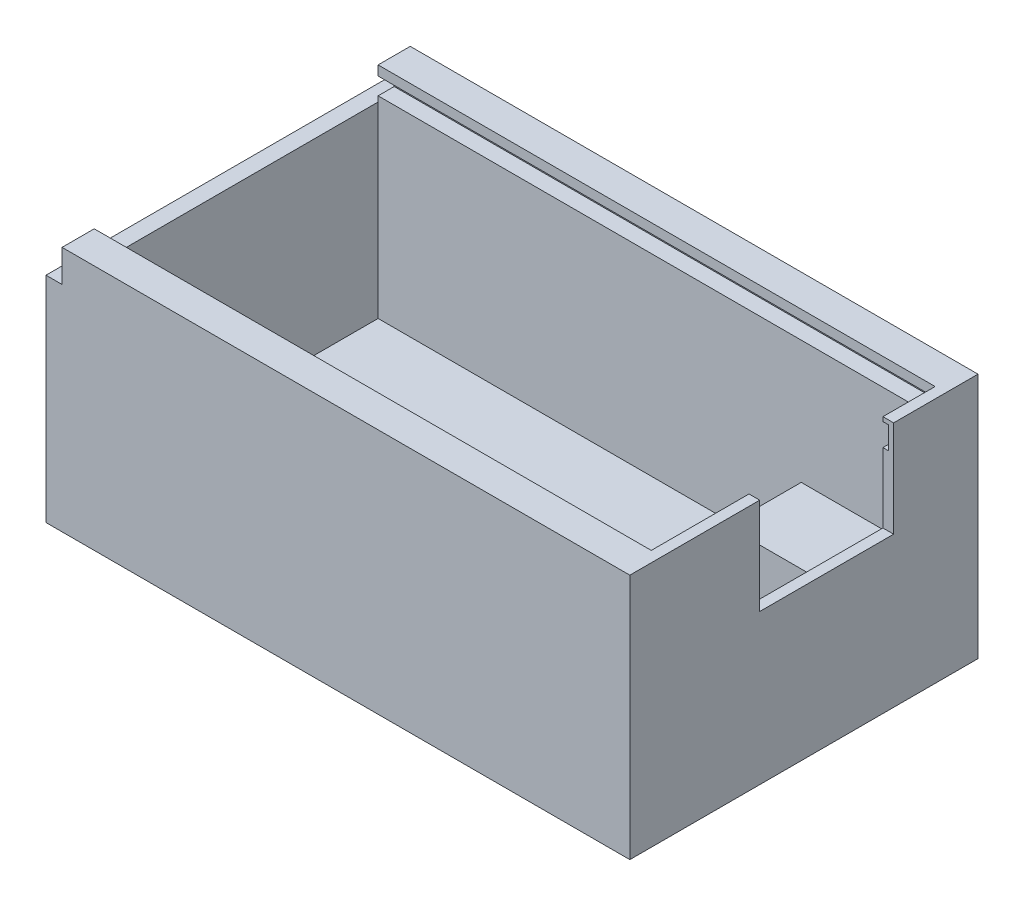
ISO-10303-21;
HEADER;
FILE_DESCRIPTION(('STEP AP214'),'2;1');
FILE_NAME('part.step','',(''),(''),'','','');
FILE_SCHEMA(('AUTOMOTIVE_DESIGN { 1 0 10303 214 1 1 1 1 }'));
ENDSEC;
DATA;
#1=APPLICATION_CONTEXT('core data for automotive mechanical design processes');
#2=APPLICATION_PROTOCOL_DEFINITION('international standard','automotive_design',2000,#1);
#3=PRODUCT_CONTEXT('',#1,'mechanical');
#4=PRODUCT('Part','Part','',(#3));
#5=PRODUCT_RELATED_PRODUCT_CATEGORY('part','',(#4));
#6=PRODUCT_DEFINITION_FORMATION('','',#4);
#7=PRODUCT_DEFINITION_CONTEXT('part definition',#1,'design');
#8=PRODUCT_DEFINITION('design','',#6,#7);
#9=PRODUCT_DEFINITION_SHAPE('','',#8);
#10=(LENGTH_UNIT() NAMED_UNIT(*) SI_UNIT(.MILLI.,.METRE.));
#11=(NAMED_UNIT(*) PLANE_ANGLE_UNIT() SI_UNIT($,.RADIAN.));
#12=(NAMED_UNIT(*) SI_UNIT($,.STERADIAN.) SOLID_ANGLE_UNIT());
#13=UNCERTAINTY_MEASURE_WITH_UNIT(LENGTH_MEASURE(1.E-05),#10,'distance_accuracy_value','');
#14=(GEOMETRIC_REPRESENTATION_CONTEXT(3) GLOBAL_UNCERTAINTY_ASSIGNED_CONTEXT((#13)) GLOBAL_UNIT_ASSIGNED_CONTEXT((#10,
#11,#12)) REPRESENTATION_CONTEXT('',''));
#15=CARTESIAN_POINT('',(0.,0.,0.));
#16=DIRECTION('',(0.,0.,1.));
#17=DIRECTION('',(1.,0.,0.));
#18=AXIS2_PLACEMENT_3D('',#15,#16,#17);
#19=CARTESIAN_POINT('',(104.,41.,0.));
#20=DIRECTION('',(-1.,0.,0.));
#21=DIRECTION('',(0.,0.,1.));
#22=AXIS2_PLACEMENT_3D('',#19,#20,#21);
#23=PLANE('',#22);
#24=DIRECTION('',(0.,0.,-1.));
#25=VECTOR('',#24,1.);
#26=CARTESIAN_POINT('',(104.,40.2,-53.));
#27=LINE('',#26,#25);
#28=CARTESIAN_POINT('',(104.,40.2,-43.25));
#29=VERTEX_POINT('',#28);
#30=CARTESIAN_POINT('',(104.,40.2,-53.));
#31=VERTEX_POINT('',#30);
#32=EDGE_CURVE('E745',#29,#31,#27,.T.);
#33=ORIENTED_EDGE('',*,*,#32,.F.);
#34=DIRECTION('',(0.,1.,0.));
#35=VECTOR('',#34,1.);
#36=CARTESIAN_POINT('',(104.,23.,-43.25));
#37=LINE('',#36,#35);
#38=CARTESIAN_POINT('',(104.,41.,-43.25));
#39=VERTEX_POINT('',#38);
#40=EDGE_CURVE('E417',#29,#39,#37,.T.);
#41=ORIENTED_EDGE('',*,*,#40,.T.);
#42=DIRECTION('',(0.,0.,1.));
#43=VECTOR('',#42,1.);
#44=CARTESIAN_POINT('',(104.,41.,-53.));
#45=LINE('',#44,#43);
#46=CARTESIAN_POINT('',(104.,41.,-53.));
#47=VERTEX_POINT('',#46);
#48=EDGE_CURVE('E394',#47,#39,#45,.T.);
#49=ORIENTED_EDGE('',*,*,#48,.F.);
#50=DIRECTION('',(0.,1.,0.));
#51=VECTOR('',#50,1.);
#52=CARTESIAN_POINT('',(104.,13.,-53.));
#53=LINE('',#52,#51);
#54=EDGE_CURVE('E399',#31,#47,#53,.T.);
#55=ORIENTED_EDGE('',*,*,#54,.F.);
#56=EDGE_LOOP('',(#33,#41,#49,#55));
#57=FACE_BOUND('',#56,.T.);
#58=ADVANCED_FACE('F48',(#57),#23,.T.);
#59=CARTESIAN_POINT('',(104.,40.2,0.));
#60=VERTEX_POINT('',#59);
#61=CARTESIAN_POINT('',(104.,40.2,-18.25));
#62=VERTEX_POINT('',#61);
#63=EDGE_CURVE('E308',#60,#62,#27,.T.);
#64=ORIENTED_EDGE('',*,*,#63,.F.);
#65=DIRECTION('',(0.,-1.,0.));
#66=VECTOR('',#65,1.);
#67=CARTESIAN_POINT('',(104.,13.,0.));
#68=LINE('',#67,#66);
#69=CARTESIAN_POINT('',(104.,41.,0.));
#70=VERTEX_POINT('',#69);
#71=EDGE_CURVE('E390',#70,#60,#68,.T.);
#72=ORIENTED_EDGE('',*,*,#71,.F.);
#73=DIRECTION('',(0.,0.,-1.));
#74=VECTOR('',#73,1.);
#75=CARTESIAN_POINT('',(104.,41.,0.));
#76=LINE('',#75,#74);
#77=CARTESIAN_POINT('',(104.,41.,-18.25));
#78=VERTEX_POINT('',#77);
#79=EDGE_CURVE('E497',#70,#78,#76,.T.);
#80=ORIENTED_EDGE('',*,*,#79,.T.);
#81=DIRECTION('',(0.,1.,0.));
#82=VECTOR('',#81,1.);
#83=CARTESIAN_POINT('',(104.,41.,-18.25));
#84=LINE('',#83,#82);
#85=EDGE_CURVE('E598',#62,#78,#84,.T.);
#86=ORIENTED_EDGE('',*,*,#85,.F.);
#87=EDGE_LOOP('',(#64,#72,#80,#86));
#88=FACE_BOUND('',#87,.T.);
#89=ADVANCED_FACE('F688',(#88),#23,.T.);
#90=CARTESIAN_POINT('',(110.886342439892,39.2,0.));
#91=DIRECTION('',(0.,0.,-1.));
#92=DIRECTION('',(-1.,0.,0.));
#93=AXIS2_PLACEMENT_3D('',#90,#91,#92);
#94=PLANE('',#93);
#95=DIRECTION('',(0.,1.,0.));
#96=VECTOR('',#95,1.);
#97=CARTESIAN_POINT('',(105.,40.2,0.));
#98=LINE('',#97,#96);
#99=CARTESIAN_POINT('',(105.,36.,0.));
#100=VERTEX_POINT('',#99);
#101=CARTESIAN_POINT('',(105.,39.2,0.));
#102=VERTEX_POINT('',#101);
#103=EDGE_CURVE('E838',#100,#102,#98,.T.);
#104=ORIENTED_EDGE('',*,*,#103,.F.);
#105=DIRECTION('',(-1.,0.,0.));
#106=VECTOR('',#105,1.);
#107=CARTESIAN_POINT('',(110.886342439892,36.,0.));
#108=LINE('',#107,#106);
#109=CARTESIAN_POINT('',(105.25,36.,0.));
#110=VERTEX_POINT('',#109);
#111=EDGE_CURVE('E360',#110,#100,#108,.T.);
#112=ORIENTED_EDGE('',*,*,#111,.F.);
#113=DIRECTION('',(0.,1.,0.));
#114=VECTOR('',#113,1.);
#115=CARTESIAN_POINT('',(105.25,39.2,0.));
#116=LINE('',#115,#114);
#117=CARTESIAN_POINT('',(105.25,39.2,0.));
#118=VERTEX_POINT('',#117);
#119=EDGE_CURVE('E349',#110,#118,#116,.T.);
#120=ORIENTED_EDGE('',*,*,#119,.T.);
#121=DIRECTION('',(-1.,0.,0.));
#122=VECTOR('',#121,1.);
#123=CARTESIAN_POINT('',(110.886342439892,39.2,0.));
#124=LINE('',#123,#122);
#125=EDGE_CURVE('E354',#118,#102,#124,.T.);
#126=ORIENTED_EDGE('',*,*,#125,.T.);
#127=EDGE_LOOP('',(#104,#112,#120,#126));
#128=FACE_BOUND('',#127,.T.);
#129=ADVANCED_FACE('F693',(#128),#94,.F.);
#130=CARTESIAN_POINT('',(110.886342439892,39.2,-53.));
#131=DIRECTION('',(0.,0.,1.));
#132=DIRECTION('',(1.,0.,0.));
#133=AXIS2_PLACEMENT_3D('',#130,#131,#132);
#134=PLANE('',#133);
#135=DIRECTION('',(0.,-1.,0.));
#136=VECTOR('',#135,1.);
#137=CARTESIAN_POINT('',(105.,40.2,-53.));
#138=LINE('',#137,#136);
#139=CARTESIAN_POINT('',(105.,39.2,-53.));
#140=VERTEX_POINT('',#139);
#141=CARTESIAN_POINT('',(105.,36.,-53.));
#142=VERTEX_POINT('',#141);
#143=EDGE_CURVE('E297',#140,#142,#138,.T.);
#144=ORIENTED_EDGE('',*,*,#143,.F.);
#145=DIRECTION('',(-1.,0.,0.));
#146=VECTOR('',#145,1.);
#147=CARTESIAN_POINT('',(110.886342439892,39.2,-53.));
#148=LINE('',#147,#146);
#149=CARTESIAN_POINT('',(105.25,39.2,-53.));
#150=VERTEX_POINT('',#149);
#151=EDGE_CURVE('E342',#150,#140,#148,.T.);
#152=ORIENTED_EDGE('',*,*,#151,.F.);
#153=DIRECTION('',(0.,-1.,0.));
#154=VECTOR('',#153,1.);
#155=CARTESIAN_POINT('',(105.25,39.2,-53.));
#156=LINE('',#155,#154);
#157=CARTESIAN_POINT('',(105.25,36.,-53.));
#158=VERTEX_POINT('',#157);
#159=EDGE_CURVE('E321',#150,#158,#156,.T.);
#160=ORIENTED_EDGE('',*,*,#159,.T.);
#161=DIRECTION('',(-1.,0.,0.));
#162=VECTOR('',#161,1.);
#163=CARTESIAN_POINT('',(110.886342439892,36.,-53.));
#164=LINE('',#163,#162);
#165=EDGE_CURVE('E313',#158,#142,#164,.T.);
#166=ORIENTED_EDGE('',*,*,#165,.T.);
#167=EDGE_LOOP('',(#144,#152,#160,#166));
#168=FACE_BOUND('',#167,.T.);
#169=ADVANCED_FACE('F319',(#168),#134,.F.);
#170=CARTESIAN_POINT('',(0.,41.,0.));
#171=DIRECTION('',(0.,0.,-1.));
#172=DIRECTION('',(-1.,0.,0.));
#173=AXIS2_PLACEMENT_3D('',#170,#171,#172);
#174=PLANE('',#173);
#175=CARTESIAN_POINT('',(0.,39.2,0.));
#176=VERTEX_POINT('',#175);
#177=EDGE_CURVE('E359',#102,#176,#124,.T.);
#178=ORIENTED_EDGE('',*,*,#177,.T.);
#179=DIRECTION('',(0.,-1.,0.));
#180=VECTOR('',#179,1.);
#181=CARTESIAN_POINT('',(0.,41.,0.));
#182=LINE('',#181,#180);
#183=CARTESIAN_POINT('',(0.,41.,0.));
#184=VERTEX_POINT('',#183);
#185=EDGE_CURVE('E582',#184,#176,#182,.T.);
#186=ORIENTED_EDGE('',*,*,#185,.F.);
#187=DIRECTION('',(1.,0.,0.));
#188=VECTOR('',#187,1.);
#189=CARTESIAN_POINT('',(0.,41.,0.));
#190=LINE('',#189,#188);
#191=EDGE_CURVE('E501',#184,#70,#190,.T.);
#192=ORIENTED_EDGE('',*,*,#191,.T.);
#193=ORIENTED_EDGE('',*,*,#71,.T.);
#194=DIRECTION('',(-1.,0.,0.));
#195=VECTOR('',#194,1.);
#196=CARTESIAN_POINT('',(105.,40.2,0.));
#197=LINE('',#196,#195);
#198=CARTESIAN_POINT('',(105.,40.2,0.));
#199=VERTEX_POINT('',#198);
#200=EDGE_CURVE('E757',#199,#60,#197,.T.);
#201=ORIENTED_EDGE('',*,*,#200,.F.);
#202=EDGE_CURVE('E317',#102,#199,#98,.T.);
#203=ORIENTED_EDGE('',*,*,#202,.F.);
#204=EDGE_LOOP('',(#178,#186,#192,#193,#201,#203));
#205=FACE_BOUND('',#204,.T.);
#206=ADVANCED_FACE('F739',(#205),#174,.T.);
#207=CARTESIAN_POINT('',(0.,41.,-53.));
#208=DIRECTION('',(0.,0.,-1.));
#209=DIRECTION('',(-1.,0.,0.));
#210=AXIS2_PLACEMENT_3D('',#207,#208,#209);
#211=PLANE('',#210);
#212=CARTESIAN_POINT('',(104.,13.,-53.));
#213=VERTEX_POINT('',#212);
#214=CARTESIAN_POINT('',(104.,36.,-53.));
#215=VERTEX_POINT('',#214);
#216=EDGE_CURVE('E400',#213,#215,#53,.T.);
#217=ORIENTED_EDGE('',*,*,#216,.T.);
#218=CARTESIAN_POINT('',(0.,36.,-53.));
#219=VERTEX_POINT('',#218);
#220=EDGE_CURVE('E325',#215,#219,#164,.T.);
#221=ORIENTED_EDGE('',*,*,#220,.T.);
#222=DIRECTION('',(0.,-1.,0.));
#223=VECTOR('',#222,1.);
#224=CARTESIAN_POINT('',(0.,41.,-53.));
#225=LINE('',#224,#223);
#226=CARTESIAN_POINT('',(0.,35.,-53.));
#227=VERTEX_POINT('',#226);
#228=EDGE_CURVE('E581',#219,#227,#225,.T.);
#229=ORIENTED_EDGE('',*,*,#228,.T.);
#230=CARTESIAN_POINT('',(0.,0.,-53.));
#231=VERTEX_POINT('',#230);
#232=EDGE_CURVE('E575',#227,#231,#225,.T.);
#233=ORIENTED_EDGE('',*,*,#232,.T.);
#234=DIRECTION('',(1.,0.,0.));
#235=VECTOR('',#234,1.);
#236=CARTESIAN_POINT('',(0.,0.,-53.));
#237=LINE('',#236,#235);
#238=CARTESIAN_POINT('',(79.,0.,-53.));
#239=VERTEX_POINT('',#238);
#240=EDGE_CURVE('E542',#231,#239,#237,.T.);
#241=ORIENTED_EDGE('',*,*,#240,.T.);
#242=DIRECTION('',(0.,-1.,0.));
#243=VECTOR('',#242,1.);
#244=CARTESIAN_POINT('',(79.,41.,-53.));
#245=LINE('',#244,#243);
#246=CARTESIAN_POINT('',(79.,13.,-53.));
#247=VERTEX_POINT('',#246);
#248=EDGE_CURVE('E572',#247,#239,#245,.T.);
#249=ORIENTED_EDGE('',*,*,#248,.F.);
#250=DIRECTION('',(-1.,0.,0.));
#251=VECTOR('',#250,1.);
#252=CARTESIAN_POINT('',(163.941638282583,13.,-53.));
#253=LINE('',#252,#251);
#254=EDGE_CURVE('E408',#213,#247,#253,.T.);
#255=ORIENTED_EDGE('',*,*,#254,.F.);
#256=EDGE_LOOP('',(#217,#221,#229,#233,#241,#249,#255));
#257=FACE_BOUND('',#256,.T.);
#258=ADVANCED_FACE('F660',(#257),#211,.F.);
#259=CARTESIAN_POINT('',(96.,23.,-43.25));
#260=DIRECTION('',(0.,0.,-1.));
#261=DIRECTION('',(-1.,0.,0.));
#262=AXIS2_PLACEMENT_3D('',#259,#260,#261);
#263=PLANE('',#262);
#264=ORIENTED_EDGE('',*,*,#40,.F.);
#265=DIRECTION('',(1.,0.,0.));
#266=VECTOR('',#265,1.);
#267=CARTESIAN_POINT('',(96.,40.2,-43.25));
#268=LINE('',#267,#266);
#269=CARTESIAN_POINT('',(105.,40.2,-43.25));
#270=VERTEX_POINT('',#269);
#271=EDGE_CURVE('E353',#29,#270,#268,.T.);
#272=ORIENTED_EDGE('',*,*,#271,.T.);
#273=DIRECTION('',(0.,1.,0.));
#274=VECTOR('',#273,1.);
#275=CARTESIAN_POINT('',(105.,23.,-43.25));
#276=LINE('',#275,#274);
#277=CARTESIAN_POINT('',(105.,36.,-43.25));
#278=VERTEX_POINT('',#277);
#279=EDGE_CURVE('E763',#278,#270,#276,.T.);
#280=ORIENTED_EDGE('',*,*,#279,.F.);
#281=DIRECTION('',(-1.,0.,0.));
#282=VECTOR('',#281,1.);
#283=CARTESIAN_POINT('',(96.,36.,-43.25));
#284=LINE('',#283,#282);
#285=CARTESIAN_POINT('',(104.,36.,-43.25));
#286=VERTEX_POINT('',#285);
#287=EDGE_CURVE('E315',#278,#286,#284,.T.);
#288=ORIENTED_EDGE('',*,*,#287,.T.);
#289=CARTESIAN_POINT('',(104.,23.,-43.25));
#290=VERTEX_POINT('',#289);
#291=EDGE_CURVE('E418',#290,#286,#37,.T.);
#292=ORIENTED_EDGE('',*,*,#291,.F.);
#293=DIRECTION('',(1.,0.,0.));
#294=VECTOR('',#293,1.);
#295=CARTESIAN_POINT('',(96.,23.,-43.25));
#296=LINE('',#295,#294);
#297=CARTESIAN_POINT('',(106.,23.,-43.25));
#298=VERTEX_POINT('',#297);
#299=EDGE_CURVE('E445',#290,#298,#296,.T.);
#300=ORIENTED_EDGE('',*,*,#299,.T.);
#301=DIRECTION('',(0.,1.,0.));
#302=VECTOR('',#301,1.);
#303=CARTESIAN_POINT('',(106.,23.,-43.25));
#304=LINE('',#303,#302);
#305=CARTESIAN_POINT('',(106.,41.,-43.25));
#306=VERTEX_POINT('',#305);
#307=EDGE_CURVE('E433',#298,#306,#304,.T.);
#308=ORIENTED_EDGE('',*,*,#307,.T.);
#309=DIRECTION('',(1.,0.,0.));
#310=VECTOR('',#309,1.);
#311=CARTESIAN_POINT('',(96.,41.,-43.25));
#312=LINE('',#311,#310);
#313=EDGE_CURVE('E442',#39,#306,#312,.T.);
#314=ORIENTED_EDGE('',*,*,#313,.F.);
#315=EDGE_LOOP('',(#264,#272,#280,#288,#292,#300,#308,#314));
#316=FACE_BOUND('',#315,.T.);
#317=ADVANCED_FACE('F775',(#316),#263,.F.);
#318=CARTESIAN_POINT('',(96.,23.,-18.25));
#319=DIRECTION('',(0.,-1.,0.));
#320=DIRECTION('',(0.,0.,-1.));
#321=AXIS2_PLACEMENT_3D('',#318,#319,#320);
#322=PLANE('',#321);
#323=ORIENTED_EDGE('',*,*,#299,.F.);
#324=DIRECTION('',(0.,0.,1.));
#325=VECTOR('',#324,1.);
#326=CARTESIAN_POINT('',(104.,23.,0.));
#327=LINE('',#326,#325);
#328=CARTESIAN_POINT('',(104.,23.,-18.25));
#329=VERTEX_POINT('',#328);
#330=EDGE_CURVE('E441',#290,#329,#327,.T.);
#331=ORIENTED_EDGE('',*,*,#330,.T.);
#332=DIRECTION('',(1.,0.,0.));
#333=VECTOR('',#332,1.);
#334=CARTESIAN_POINT('',(96.,23.,-18.25));
#335=LINE('',#334,#333);
#336=CARTESIAN_POINT('',(106.,23.,-18.25));
#337=VERTEX_POINT('',#336);
#338=EDGE_CURVE('E437',#329,#337,#335,.T.);
#339=ORIENTED_EDGE('',*,*,#338,.T.);
#340=DIRECTION('',(0.,0.,-1.));
#341=VECTOR('',#340,1.);
#342=CARTESIAN_POINT('',(106.,23.,-18.25));
#343=LINE('',#342,#341);
#344=EDGE_CURVE('E429',#337,#298,#343,.T.);
#345=ORIENTED_EDGE('',*,*,#344,.T.);
#346=EDGE_LOOP('',(#323,#331,#339,#345));
#347=FACE_BOUND('',#346,.T.);
#348=ADVANCED_FACE('F804',(#347),#322,.F.);
#349=CARTESIAN_POINT('',(0.,41.,0.));
#350=DIRECTION('',(0.,1.,0.));
#351=DIRECTION('',(0.,0.,1.));
#352=AXIS2_PLACEMENT_3D('',#349,#350,#351);
#353=PLANE('',#352);
#354=ORIENTED_EDGE('',*,*,#79,.F.);
#355=ORIENTED_EDGE('',*,*,#191,.F.);
#356=DIRECTION('',(0.,0.,1.));
#357=VECTOR('',#356,1.);
#358=CARTESIAN_POINT('',(0.,41.,0.));
#359=LINE('',#358,#357);
#360=CARTESIAN_POINT('',(0.,41.,6.));
#361=VERTEX_POINT('',#360);
#362=EDGE_CURVE('E566',#184,#361,#359,.T.);
#363=ORIENTED_EDGE('',*,*,#362,.T.);
#364=DIRECTION('',(1.,0.,0.));
#365=VECTOR('',#364,1.);
#366=CARTESIAN_POINT('',(0.,41.,6.));
#367=LINE('',#366,#365);
#368=CARTESIAN_POINT('',(106.,41.,6.));
#369=VERTEX_POINT('',#368);
#370=EDGE_CURVE('E510',#361,#369,#367,.T.);
#371=ORIENTED_EDGE('',*,*,#370,.T.);
#372=DIRECTION('',(0.,0.,-1.));
#373=VECTOR('',#372,1.);
#374=CARTESIAN_POINT('',(106.,41.,0.));
#375=LINE('',#374,#373);
#376=CARTESIAN_POINT('',(106.,41.,-18.25));
#377=VERTEX_POINT('',#376);
#378=EDGE_CURVE('E514',#369,#377,#375,.T.);
#379=ORIENTED_EDGE('',*,*,#378,.T.);
#380=DIRECTION('',(1.,0.,0.));
#381=VECTOR('',#380,1.);
#382=CARTESIAN_POINT('',(96.,41.,-18.25));
#383=LINE('',#382,#381);
#384=EDGE_CURVE('E438',#78,#377,#383,.T.);
#385=ORIENTED_EDGE('',*,*,#384,.F.);
#386=EDGE_LOOP('',(#354,#355,#363,#371,#379,#385));
#387=FACE_BOUND('',#386,.T.);
#388=ADVANCED_FACE('F721',(#387),#353,.T.);
#389=DIRECTION('',(1.,0.,0.));
#390=VECTOR('',#389,1.);
#391=CARTESIAN_POINT('',(0.,41.,-53.));
#392=LINE('',#391,#390);
#393=CARTESIAN_POINT('',(0.,41.,-53.));
#394=VERTEX_POINT('',#393);
#395=EDGE_CURVE('E506',#394,#47,#392,.T.);
#396=ORIENTED_EDGE('',*,*,#395,.T.);
#397=ORIENTED_EDGE('',*,*,#48,.T.);
#398=ORIENTED_EDGE('',*,*,#313,.T.);
#399=CARTESIAN_POINT('',(106.,41.,-59.));
#400=VERTEX_POINT('',#399);
#401=EDGE_CURVE('E513',#306,#400,#375,.T.);
#402=ORIENTED_EDGE('',*,*,#401,.T.);
#403=DIRECTION('',(1.,0.,0.));
#404=VECTOR('',#403,1.);
#405=CARTESIAN_POINT('',(0.,41.,-59.));
#406=LINE('',#405,#404);
#407=CARTESIAN_POINT('',(0.,41.,-59.));
#408=VERTEX_POINT('',#407);
#409=EDGE_CURVE('E518',#408,#400,#406,.T.);
#410=ORIENTED_EDGE('',*,*,#409,.F.);
#411=DIRECTION('',(0.,0.,1.));
#412=VECTOR('',#411,1.);
#413=CARTESIAN_POINT('',(0.,41.,-59.));
#414=LINE('',#413,#412);
#415=EDGE_CURVE('E467',#408,#394,#414,.T.);
#416=ORIENTED_EDGE('',*,*,#415,.T.);
#417=EDGE_LOOP('',(#396,#397,#398,#402,#410,#416));
#418=FACE_BOUND('',#417,.T.);
#419=ADVANCED_FACE('F716',(#418),#353,.T.);
#420=CARTESIAN_POINT('',(0.,41.,6.));
#421=DIRECTION('',(0.,0.,-1.));
#422=DIRECTION('',(-1.,0.,0.));
#423=AXIS2_PLACEMENT_3D('',#420,#421,#422);
#424=PLANE('',#423);
#425=DIRECTION('',(0.,-1.,0.));
#426=VECTOR('',#425,1.);
#427=CARTESIAN_POINT('',(0.,41.,6.));
#428=LINE('',#427,#426);
#429=CARTESIAN_POINT('',(0.,35.,6.));
#430=VERTEX_POINT('',#429);
#431=EDGE_CURVE('E462',#361,#430,#428,.T.);
#432=ORIENTED_EDGE('',*,*,#431,.T.);
#433=DIRECTION('',(-1.,0.,0.));
#434=VECTOR('',#433,1.);
#435=CARTESIAN_POINT('',(0.,35.,6.));
#436=LINE('',#435,#434);
#437=CARTESIAN_POINT('',(-3.,35.,6.));
#438=VERTEX_POINT('',#437);
#439=EDGE_CURVE('E474',#430,#438,#436,.T.);
#440=ORIENTED_EDGE('',*,*,#439,.T.);
#441=DIRECTION('',(0.,-1.,0.));
#442=VECTOR('',#441,1.);
#443=CARTESIAN_POINT('',(-3.,41.,6.));
#444=LINE('',#443,#442);
#445=CARTESIAN_POINT('',(-3.,-5.,6.));
#446=VERTEX_POINT('',#445);
#447=EDGE_CURVE('E553',#438,#446,#444,.T.);
#448=ORIENTED_EDGE('',*,*,#447,.T.);
#449=DIRECTION('',(-1.,0.,0.));
#450=VECTOR('',#449,1.);
#451=CARTESIAN_POINT('',(-3.,-5.,6.));
#452=LINE('',#451,#450);
#453=CARTESIAN_POINT('',(106.,-5.,6.));
#454=VERTEX_POINT('',#453);
#455=EDGE_CURVE('E492',#454,#446,#452,.T.);
#456=ORIENTED_EDGE('',*,*,#455,.F.);
#457=DIRECTION('',(0.,-1.,0.));
#458=VECTOR('',#457,1.);
#459=CARTESIAN_POINT('',(106.,41.,6.));
#460=LINE('',#459,#458);
#461=EDGE_CURVE('E563',#369,#454,#460,.T.);
#462=ORIENTED_EDGE('',*,*,#461,.F.);
#463=ORIENTED_EDGE('',*,*,#370,.F.);
#464=EDGE_LOOP('',(#432,#440,#448,#456,#462,#463));
#465=FACE_BOUND('',#464,.T.);
#466=ADVANCED_FACE('F708',(#465),#424,.F.);
#467=CARTESIAN_POINT('',(106.,41.,0.));
#468=DIRECTION('',(-1.,0.,0.));
#469=DIRECTION('',(0.,0.,1.));
#470=AXIS2_PLACEMENT_3D('',#467,#468,#469);
#471=PLANE('',#470);
#472=ORIENTED_EDGE('',*,*,#344,.F.);
#473=DIRECTION('',(0.,-1.,0.));
#474=VECTOR('',#473,1.);
#475=CARTESIAN_POINT('',(106.,23.,-18.25));
#476=LINE('',#475,#474);
#477=EDGE_CURVE('E425',#377,#337,#476,.T.);
#478=ORIENTED_EDGE('',*,*,#477,.F.);
#479=ORIENTED_EDGE('',*,*,#378,.F.);
#480=ORIENTED_EDGE('',*,*,#461,.T.);
#481=DIRECTION('',(0.,0.,1.));
#482=VECTOR('',#481,1.);
#483=CARTESIAN_POINT('',(106.,-5.,6.));
#484=LINE('',#483,#482);
#485=CARTESIAN_POINT('',(106.,-5.,-59.));
#486=VERTEX_POINT('',#485);
#487=EDGE_CURVE('E488',#486,#454,#484,.T.);
#488=ORIENTED_EDGE('',*,*,#487,.F.);
#489=DIRECTION('',(0.,-1.,0.));
#490=VECTOR('',#489,1.);
#491=CARTESIAN_POINT('',(106.,41.,-59.));
#492=LINE('',#491,#490);
#493=EDGE_CURVE('E560',#400,#486,#492,.T.);
#494=ORIENTED_EDGE('',*,*,#493,.F.);
#495=ORIENTED_EDGE('',*,*,#401,.F.);
#496=ORIENTED_EDGE('',*,*,#307,.F.);
#497=EDGE_LOOP('',(#472,#478,#479,#480,#488,#494,#495,#496));
#498=FACE_BOUND('',#497,.T.);
#499=ADVANCED_FACE('F702',(#498),#471,.F.);
#500=CARTESIAN_POINT('',(0.,41.,-59.));
#501=DIRECTION('',(0.,0.,-1.));
#502=DIRECTION('',(-1.,0.,0.));
#503=AXIS2_PLACEMENT_3D('',#500,#501,#502);
#504=PLANE('',#503);
#505=DIRECTION('',(-1.,0.,0.));
#506=VECTOR('',#505,1.);
#507=CARTESIAN_POINT('',(0.,35.,-59.));
#508=LINE('',#507,#506);
#509=CARTESIAN_POINT('',(0.,35.,-59.));
#510=VERTEX_POINT('',#509);
#511=CARTESIAN_POINT('',(-3.,35.,-59.));
#512=VERTEX_POINT('',#511);
#513=EDGE_CURVE('E471',#510,#512,#508,.T.);
#514=ORIENTED_EDGE('',*,*,#513,.F.);
#515=DIRECTION('',(0.,-1.,0.));
#516=VECTOR('',#515,1.);
#517=CARTESIAN_POINT('',(0.,41.,-59.));
#518=LINE('',#517,#516);
#519=EDGE_CURVE('E453',#408,#510,#518,.T.);
#520=ORIENTED_EDGE('',*,*,#519,.F.);
#521=ORIENTED_EDGE('',*,*,#409,.T.);
#522=ORIENTED_EDGE('',*,*,#493,.T.);
#523=DIRECTION('',(1.,0.,0.));
#524=VECTOR('',#523,1.);
#525=CARTESIAN_POINT('',(-3.,-5.,-59.));
#526=LINE('',#525,#524);
#527=CARTESIAN_POINT('',(-3.,-5.,-59.));
#528=VERTEX_POINT('',#527);
#529=EDGE_CURVE('E484',#528,#486,#526,.T.);
#530=ORIENTED_EDGE('',*,*,#529,.F.);
#531=DIRECTION('',(0.,-1.,0.));
#532=VECTOR('',#531,1.);
#533=CARTESIAN_POINT('',(-3.,41.,-59.));
#534=LINE('',#533,#532);
#535=EDGE_CURVE('E556',#512,#528,#534,.T.);
#536=ORIENTED_EDGE('',*,*,#535,.F.);
#537=EDGE_LOOP('',(#514,#520,#521,#522,#530,#536));
#538=FACE_BOUND('',#537,.T.);
#539=ADVANCED_FACE('F697',(#538),#504,.T.);
#540=DIRECTION('',(0.,0.,1.));
#541=VECTOR('',#540,1.);
#542=CARTESIAN_POINT('',(104.,36.,-53.));
#543=LINE('',#542,#541);
#544=EDGE_CURVE('E748',#215,#286,#543,.T.);
#545=ORIENTED_EDGE('',*,*,#544,.F.);
#546=ORIENTED_EDGE('',*,*,#216,.F.);
#547=DIRECTION('',(0.,0.,-1.));
#548=VECTOR('',#547,1.);
#549=CARTESIAN_POINT('',(104.,13.,-53.));
#550=LINE('',#549,#548);
#551=CARTESIAN_POINT('',(104.,13.,-39.));
#552=VERTEX_POINT('',#551);
#553=EDGE_CURVE('E404',#552,#213,#550,.T.);
#554=ORIENTED_EDGE('',*,*,#553,.F.);
#555=DIRECTION('',(0.,-1.,0.));
#556=VECTOR('',#555,1.);
#557=CARTESIAN_POINT('',(104.,41.,-39.));
#558=LINE('',#557,#556);
#559=CARTESIAN_POINT('',(104.,0.,-39.));
#560=VERTEX_POINT('',#559);
#561=EDGE_CURVE('E522',#552,#560,#558,.T.);
#562=ORIENTED_EDGE('',*,*,#561,.T.);
#563=DIRECTION('',(0.,0.,-1.));
#564=VECTOR('',#563,1.);
#565=CARTESIAN_POINT('',(104.,0.,0.));
#566=LINE('',#565,#564);
#567=CARTESIAN_POINT('',(104.,0.,-14.));
#568=VERTEX_POINT('',#567);
#569=EDGE_CURVE('E496',#568,#560,#566,.T.);
#570=ORIENTED_EDGE('',*,*,#569,.F.);
#571=DIRECTION('',(0.,-1.,0.));
#572=VECTOR('',#571,1.);
#573=CARTESIAN_POINT('',(104.,41.,-14.));
#574=LINE('',#573,#572);
#575=CARTESIAN_POINT('',(104.,13.,-14.));
#576=VERTEX_POINT('',#575);
#577=EDGE_CURVE('E557',#576,#568,#574,.T.);
#578=ORIENTED_EDGE('',*,*,#577,.F.);
#579=CARTESIAN_POINT('',(104.,13.,0.));
#580=VERTEX_POINT('',#579);
#581=EDGE_CURVE('E414',#580,#576,#550,.T.);
#582=ORIENTED_EDGE('',*,*,#581,.F.);
#583=CARTESIAN_POINT('',(104.,36.,0.));
#584=VERTEX_POINT('',#583);
#585=EDGE_CURVE('E395',#584,#580,#68,.T.);
#586=ORIENTED_EDGE('',*,*,#585,.F.);
#587=CARTESIAN_POINT('',(104.,36.,-18.25));
#588=VERTEX_POINT('',#587);
#589=EDGE_CURVE('E793',#588,#584,#543,.T.);
#590=ORIENTED_EDGE('',*,*,#589,.F.);
#591=EDGE_CURVE('E599',#329,#588,#84,.T.);
#592=ORIENTED_EDGE('',*,*,#591,.F.);
#593=ORIENTED_EDGE('',*,*,#330,.F.);
#594=ORIENTED_EDGE('',*,*,#291,.T.);
#595=EDGE_LOOP('',(#545,#546,#554,#562,#570,#578,#582,#586,#590,#592,#593,#594));
#596=FACE_BOUND('',#595,.T.);
#597=ADVANCED_FACE('F50',(#596),#23,.T.);
#598=CARTESIAN_POINT('',(0.,41.,-14.));
#599=DIRECTION('',(0.,0.,-1.));
#600=DIRECTION('',(-1.,0.,0.));
#601=AXIS2_PLACEMENT_3D('',#598,#599,#600);
#602=PLANE('',#601);
#603=DIRECTION('',(-1.,0.,0.));
#604=VECTOR('',#603,1.);
#605=CARTESIAN_POINT('',(0.,13.,-14.));
#606=LINE('',#605,#604);
#607=CARTESIAN_POINT('',(79.,13.,-14.));
#608=VERTEX_POINT('',#607);
#609=EDGE_CURVE('E422',#576,#608,#606,.T.);
#610=ORIENTED_EDGE('',*,*,#609,.F.);
#611=ORIENTED_EDGE('',*,*,#577,.T.);
#612=DIRECTION('',(1.,0.,0.));
#613=VECTOR('',#612,1.);
#614=CARTESIAN_POINT('',(0.,0.,-14.));
#615=LINE('',#614,#613);
#616=CARTESIAN_POINT('',(79.,0.,-14.));
#617=VERTEX_POINT('',#616);
#618=EDGE_CURVE('E526',#617,#568,#615,.T.);
#619=ORIENTED_EDGE('',*,*,#618,.F.);
#620=DIRECTION('',(0.,-1.,0.));
#621=VECTOR('',#620,1.);
#622=CARTESIAN_POINT('',(79.,41.,-14.));
#623=LINE('',#622,#621);
#624=EDGE_CURVE('E590',#608,#617,#623,.T.);
#625=ORIENTED_EDGE('',*,*,#624,.F.);
#626=EDGE_LOOP('',(#610,#611,#619,#625));
#627=FACE_BOUND('',#626,.T.);
#628=ADVANCED_FACE('F628',(#627),#602,.T.);
#629=CARTESIAN_POINT('',(79.,41.,0.));
#630=DIRECTION('',(1.,0.,0.));
#631=DIRECTION('',(0.,0.,-1.));
#632=AXIS2_PLACEMENT_3D('',#629,#630,#631);
#633=PLANE('',#632);
#634=DIRECTION('',(0.,-1.,0.));
#635=VECTOR('',#634,1.);
#636=CARTESIAN_POINT('',(79.,41.,0.));
#637=LINE('',#636,#635);
#638=CARTESIAN_POINT('',(79.,13.,0.));
#639=VERTEX_POINT('',#638);
#640=CARTESIAN_POINT('',(79.,0.,0.));
#641=VERTEX_POINT('',#640);
#642=EDGE_CURVE('E586',#639,#641,#637,.T.);
#643=ORIENTED_EDGE('',*,*,#642,.F.);
#644=DIRECTION('',(0.,0.,1.));
#645=VECTOR('',#644,1.);
#646=CARTESIAN_POINT('',(79.,13.,-53.));
#647=LINE('',#646,#645);
#648=EDGE_CURVE('E348',#608,#639,#647,.T.);
#649=ORIENTED_EDGE('',*,*,#648,.F.);
#650=ORIENTED_EDGE('',*,*,#624,.T.);
#651=DIRECTION('',(0.,0.,1.));
#652=VECTOR('',#651,1.);
#653=CARTESIAN_POINT('',(79.,0.,0.));
#654=LINE('',#653,#652);
#655=EDGE_CURVE('E530',#617,#641,#654,.T.);
#656=ORIENTED_EDGE('',*,*,#655,.T.);
#657=EDGE_LOOP('',(#643,#649,#650,#656));
#658=FACE_BOUND('',#657,.T.);
#659=ADVANCED_FACE('F637',(#658),#633,.F.);
#660=CARTESIAN_POINT('',(0.,36.,0.));
#661=VERTEX_POINT('',#660);
#662=EDGE_CURVE('E364',#584,#661,#108,.T.);
#663=ORIENTED_EDGE('',*,*,#662,.F.);
#664=ORIENTED_EDGE('',*,*,#585,.T.);
#665=DIRECTION('',(-1.,0.,0.));
#666=VECTOR('',#665,1.);
#667=CARTESIAN_POINT('',(163.941638282583,13.,0.));
#668=LINE('',#667,#666);
#669=EDGE_CURVE('E409',#580,#639,#668,.T.);
#670=ORIENTED_EDGE('',*,*,#669,.T.);
#671=ORIENTED_EDGE('',*,*,#642,.T.);
#672=DIRECTION('',(1.,0.,0.));
#673=VECTOR('',#672,1.);
#674=CARTESIAN_POINT('',(0.,0.,0.));
#675=LINE('',#674,#673);
#676=CARTESIAN_POINT('',(0.,0.,0.));
#677=VERTEX_POINT('',#676);
#678=EDGE_CURVE('E534',#677,#641,#675,.T.);
#679=ORIENTED_EDGE('',*,*,#678,.F.);
#680=CARTESIAN_POINT('',(0.,35.,0.));
#681=VERTEX_POINT('',#680);
#682=EDGE_CURVE('E580',#681,#677,#182,.T.);
#683=ORIENTED_EDGE('',*,*,#682,.F.);
#684=EDGE_CURVE('E587',#661,#681,#182,.T.);
#685=ORIENTED_EDGE('',*,*,#684,.F.);
#686=EDGE_LOOP('',(#663,#664,#670,#671,#679,#683,#685));
#687=FACE_BOUND('',#686,.T.);
#688=ADVANCED_FACE('F789',(#687),#174,.T.);
#689=CARTESIAN_POINT('',(0.,41.,0.));
#690=DIRECTION('',(-1.,0.,0.));
#691=DIRECTION('',(0.,0.,1.));
#692=AXIS2_PLACEMENT_3D('',#689,#690,#691);
#693=PLANE('',#692);
#694=ORIENTED_EDGE('',*,*,#232,.F.);
#695=DIRECTION('',(0.,0.,1.));
#696=VECTOR('',#695,1.);
#697=CARTESIAN_POINT('',(0.,35.,-59.));
#698=LINE('',#697,#696);
#699=EDGE_CURVE('E463',#227,#681,#698,.T.);
#700=ORIENTED_EDGE('',*,*,#699,.T.);
#701=ORIENTED_EDGE('',*,*,#682,.T.);
#702=DIRECTION('',(0.,0.,-1.));
#703=VECTOR('',#702,1.);
#704=CARTESIAN_POINT('',(0.,0.,0.));
#705=LINE('',#704,#703);
#706=EDGE_CURVE('E538',#677,#231,#705,.T.);
#707=ORIENTED_EDGE('',*,*,#706,.T.);
#708=EDGE_LOOP('',(#694,#700,#701,#707));
#709=FACE_BOUND('',#708,.T.);
#710=ADVANCED_FACE('F671',(#709),#693,.F.);
#711=CARTESIAN_POINT('',(0.,39.2,-53.));
#712=VERTEX_POINT('',#711);
#713=EDGE_CURVE('E576',#394,#712,#225,.T.);
#714=ORIENTED_EDGE('',*,*,#713,.T.);
#715=EDGE_CURVE('E72',#140,#712,#148,.T.);
#716=ORIENTED_EDGE('',*,*,#715,.F.);
#717=CARTESIAN_POINT('',(105.,40.2,-53.));
#718=VERTEX_POINT('',#717);
#719=EDGE_CURVE('E303',#718,#140,#138,.T.);
#720=ORIENTED_EDGE('',*,*,#719,.F.);
#721=DIRECTION('',(-1.,0.,0.));
#722=VECTOR('',#721,1.);
#723=CARTESIAN_POINT('',(105.,40.2,-53.));
#724=LINE('',#723,#722);
#725=EDGE_CURVE('E752',#718,#31,#724,.T.);
#726=ORIENTED_EDGE('',*,*,#725,.T.);
#727=ORIENTED_EDGE('',*,*,#54,.T.);
#728=ORIENTED_EDGE('',*,*,#395,.F.);
#729=EDGE_LOOP('',(#714,#716,#720,#726,#727,#728));
#730=FACE_BOUND('',#729,.T.);
#731=ADVANCED_FACE('F677',(#730),#211,.F.);
#732=CARTESIAN_POINT('',(79.,41.,0.));
#733=DIRECTION('',(1.,0.,0.));
#734=DIRECTION('',(0.,0.,-1.));
#735=AXIS2_PLACEMENT_3D('',#732,#733,#734);
#736=PLANE('',#735);
#737=DIRECTION('',(0.,-1.,0.));
#738=VECTOR('',#737,1.);
#739=CARTESIAN_POINT('',(79.,41.,-39.));
#740=LINE('',#739,#738);
#741=CARTESIAN_POINT('',(79.,13.,-39.));
#742=VERTEX_POINT('',#741);
#743=CARTESIAN_POINT('',(79.,0.,-39.));
#744=VERTEX_POINT('',#743);
#745=EDGE_CURVE('E569',#742,#744,#740,.T.);
#746=ORIENTED_EDGE('',*,*,#745,.F.);
#747=EDGE_CURVE('E405',#247,#742,#647,.T.);
#748=ORIENTED_EDGE('',*,*,#747,.F.);
#749=ORIENTED_EDGE('',*,*,#248,.T.);
#750=DIRECTION('',(0.,0.,1.));
#751=VECTOR('',#750,1.);
#752=CARTESIAN_POINT('',(79.,0.,0.));
#753=LINE('',#752,#751);
#754=EDGE_CURVE('E546',#239,#744,#753,.T.);
#755=ORIENTED_EDGE('',*,*,#754,.T.);
#756=EDGE_LOOP('',(#746,#748,#749,#755));
#757=FACE_BOUND('',#756,.T.);
#758=ADVANCED_FACE('F675',(#757),#736,.F.);
#759=CARTESIAN_POINT('',(0.,41.,-39.));
#760=DIRECTION('',(0.,0.,1.));
#761=DIRECTION('',(1.,0.,0.));
#762=AXIS2_PLACEMENT_3D('',#759,#760,#761);
#763=PLANE('',#762);
#764=DIRECTION('',(1.,0.,0.));
#765=VECTOR('',#764,1.);
#766=CARTESIAN_POINT('',(0.,13.,-39.));
#767=LINE('',#766,#765);
#768=EDGE_CURVE('E57',#742,#552,#767,.T.);
#769=ORIENTED_EDGE('',*,*,#768,.F.);
#770=ORIENTED_EDGE('',*,*,#745,.T.);
#771=DIRECTION('',(-1.,0.,0.));
#772=VECTOR('',#771,1.);
#773=CARTESIAN_POINT('',(0.,0.,-39.));
#774=LINE('',#773,#772);
#775=EDGE_CURVE('E502',#560,#744,#774,.T.);
#776=ORIENTED_EDGE('',*,*,#775,.F.);
#777=ORIENTED_EDGE('',*,*,#561,.F.);
#778=EDGE_LOOP('',(#769,#770,#776,#777));
#779=FACE_BOUND('',#778,.T.);
#780=ADVANCED_FACE('F617',(#779),#763,.T.);
#781=CARTESIAN_POINT('',(-3.,41.,0.));
#782=DIRECTION('',(-1.,0.,0.));
#783=DIRECTION('',(0.,0.,1.));
#784=AXIS2_PLACEMENT_3D('',#781,#782,#783);
#785=PLANE('',#784);
#786=DIRECTION('',(0.,0.,1.));
#787=VECTOR('',#786,1.);
#788=CARTESIAN_POINT('',(-3.,35.,-59.));
#789=LINE('',#788,#787);
#790=EDGE_CURVE('E452',#512,#438,#789,.T.);
#791=ORIENTED_EDGE('',*,*,#790,.F.);
#792=ORIENTED_EDGE('',*,*,#535,.T.);
#793=DIRECTION('',(0.,0.,-1.));
#794=VECTOR('',#793,1.);
#795=CARTESIAN_POINT('',(-3.,-5.,6.));
#796=LINE('',#795,#794);
#797=EDGE_CURVE('E478',#446,#528,#796,.T.);
#798=ORIENTED_EDGE('',*,*,#797,.F.);
#799=ORIENTED_EDGE('',*,*,#447,.F.);
#800=EDGE_LOOP('',(#791,#792,#798,#799));
#801=FACE_BOUND('',#800,.T.);
#802=ADVANCED_FACE('F683',(#801),#785,.T.);
#803=CARTESIAN_POINT('',(0.,0.,0.));
#804=DIRECTION('',(0.,-1.,0.));
#805=DIRECTION('',(0.,0.,-1.));
#806=AXIS2_PLACEMENT_3D('',#803,#804,#805);
#807=PLANE('',#806);
#808=ORIENTED_EDGE('',*,*,#618,.T.);
#809=ORIENTED_EDGE('',*,*,#569,.T.);
#810=ORIENTED_EDGE('',*,*,#775,.T.);
#811=ORIENTED_EDGE('',*,*,#754,.F.);
#812=ORIENTED_EDGE('',*,*,#240,.F.);
#813=ORIENTED_EDGE('',*,*,#706,.F.);
#814=ORIENTED_EDGE('',*,*,#678,.T.);
#815=ORIENTED_EDGE('',*,*,#655,.F.);
#816=EDGE_LOOP('',(#808,#809,#810,#811,#812,#813,#814,#815));
#817=FACE_BOUND('',#816,.T.);
#818=ADVANCED_FACE('F620',(#817),#807,.F.);
#819=CARTESIAN_POINT('',(0.,-5.,0.));
#820=DIRECTION('',(0.,-1.,0.));
#821=DIRECTION('',(0.,0.,-1.));
#822=AXIS2_PLACEMENT_3D('',#819,#820,#821);
#823=PLANE('',#822);
#824=ORIENTED_EDGE('',*,*,#797,.T.);
#825=ORIENTED_EDGE('',*,*,#529,.T.);
#826=ORIENTED_EDGE('',*,*,#487,.T.);
#827=ORIENTED_EDGE('',*,*,#455,.T.);
#828=EDGE_LOOP('',(#824,#825,#826,#827));
#829=FACE_BOUND('',#828,.T.);
#830=ADVANCED_FACE('F828',(#829),#823,.T.);
#831=CARTESIAN_POINT('',(0.,0.,0.));
#832=DIRECTION('',(-1.,0.,0.));
#833=DIRECTION('',(0.,0.,1.));
#834=AXIS2_PLACEMENT_3D('',#831,#832,#833);
#835=PLANE('',#834);
#836=DIRECTION('',(0.,0.,1.));
#837=VECTOR('',#836,1.);
#838=CARTESIAN_POINT('',(0.,36.,-53.));
#839=LINE('',#838,#837);
#840=CARTESIAN_POINT('',(0.,36.,-56.));
#841=VERTEX_POINT('',#840);
#842=EDGE_CURVE('E335',#841,#219,#839,.T.);
#843=ORIENTED_EDGE('',*,*,#842,.F.);
#844=DIRECTION('',(0.,-1.,0.));
#845=VECTOR('',#844,1.);
#846=CARTESIAN_POINT('',(0.,39.2,-56.));
#847=LINE('',#846,#845);
#848=CARTESIAN_POINT('',(0.,39.2,-56.));
#849=VERTEX_POINT('',#848);
#850=EDGE_CURVE('E647',#849,#841,#847,.T.);
#851=ORIENTED_EDGE('',*,*,#850,.F.);
#852=DIRECTION('',(0.,0.,-1.));
#853=VECTOR('',#852,1.);
#854=CARTESIAN_POINT('',(0.,39.2,-53.));
#855=LINE('',#854,#853);
#856=EDGE_CURVE('E382',#712,#849,#855,.T.);
#857=ORIENTED_EDGE('',*,*,#856,.F.);
#858=ORIENTED_EDGE('',*,*,#713,.F.);
#859=ORIENTED_EDGE('',*,*,#415,.F.);
#860=ORIENTED_EDGE('',*,*,#519,.T.);
#861=EDGE_CURVE('E458',#510,#227,#698,.T.);
#862=ORIENTED_EDGE('',*,*,#861,.T.);
#863=ORIENTED_EDGE('',*,*,#228,.F.);
#864=EDGE_LOOP('',(#843,#851,#857,#858,#859,#860,#862,#863));
#865=FACE_BOUND('',#864,.T.);
#866=ADVANCED_FACE('F662',(#865),#835,.T.);
#867=CARTESIAN_POINT('',(0.,35.,-59.));
#868=DIRECTION('',(0.,-1.,0.));
#869=DIRECTION('',(0.,0.,-1.));
#870=AXIS2_PLACEMENT_3D('',#867,#868,#869);
#871=PLANE('',#870);
#872=ORIENTED_EDGE('',*,*,#790,.T.);
#873=ORIENTED_EDGE('',*,*,#439,.F.);
#874=EDGE_CURVE('E457',#681,#430,#698,.T.);
#875=ORIENTED_EDGE('',*,*,#874,.F.);
#876=ORIENTED_EDGE('',*,*,#699,.F.);
#877=ORIENTED_EDGE('',*,*,#861,.F.);
#878=ORIENTED_EDGE('',*,*,#513,.T.);
#879=EDGE_LOOP('',(#872,#873,#875,#876,#877,#878));
#880=FACE_BOUND('',#879,.T.);
#881=ADVANCED_FACE('F820',(#880),#871,.F.);
#882=DIRECTION('',(0.,0.,-1.));
#883=VECTOR('',#882,1.);
#884=CARTESIAN_POINT('',(0.,39.2,0.));
#885=LINE('',#884,#883);
#886=CARTESIAN_POINT('',(0.,39.2,3.00000000000001));
#887=VERTEX_POINT('',#886);
#888=EDGE_CURVE('E379',#887,#176,#885,.T.);
#889=ORIENTED_EDGE('',*,*,#888,.F.);
#890=DIRECTION('',(0.,1.,0.));
#891=VECTOR('',#890,1.);
#892=CARTESIAN_POINT('',(0.,39.2,3.00000000000001));
#893=LINE('',#892,#891);
#894=CARTESIAN_POINT('',(0.,36.,3.00000000000001));
#895=VERTEX_POINT('',#894);
#896=EDGE_CURVE('E358',#895,#887,#893,.T.);
#897=ORIENTED_EDGE('',*,*,#896,.F.);
#898=DIRECTION('',(0.,0.,1.));
#899=VECTOR('',#898,1.);
#900=CARTESIAN_POINT('',(0.,36.,0.));
#901=LINE('',#900,#899);
#902=EDGE_CURVE('E375',#661,#895,#901,.T.);
#903=ORIENTED_EDGE('',*,*,#902,.F.);
#904=ORIENTED_EDGE('',*,*,#684,.T.);
#905=ORIENTED_EDGE('',*,*,#874,.T.);
#906=ORIENTED_EDGE('',*,*,#431,.F.);
#907=ORIENTED_EDGE('',*,*,#362,.F.);
#908=ORIENTED_EDGE('',*,*,#185,.T.);
#909=EDGE_LOOP('',(#889,#897,#903,#904,#905,#906,#907,#908));
#910=FACE_BOUND('',#909,.T.);
#911=ADVANCED_FACE('F729',(#910),#835,.T.);
#912=CARTESIAN_POINT('',(96.,23.,-18.25));
#913=DIRECTION('',(0.,0.,1.));
#914=DIRECTION('',(0.,-1.,0.));
#915=AXIS2_PLACEMENT_3D('',#912,#913,#914);
#916=PLANE('',#915);
#917=DIRECTION('',(0.,-1.,0.));
#918=VECTOR('',#917,1.);
#919=CARTESIAN_POINT('',(105.,23.,-18.25));
#920=LINE('',#919,#918);
#921=CARTESIAN_POINT('',(105.,40.2,-18.25));
#922=VERTEX_POINT('',#921);
#923=CARTESIAN_POINT('',(105.,36.,-18.25));
#924=VERTEX_POINT('',#923);
#925=EDGE_CURVE('E756',#922,#924,#920,.T.);
#926=ORIENTED_EDGE('',*,*,#925,.F.);
#927=DIRECTION('',(-1.,0.,0.));
#928=VECTOR('',#927,1.);
#929=CARTESIAN_POINT('',(96.,40.2,-18.25));
#930=LINE('',#929,#928);
#931=EDGE_CURVE('E13',#922,#62,#930,.T.);
#932=ORIENTED_EDGE('',*,*,#931,.T.);
#933=ORIENTED_EDGE('',*,*,#85,.T.);
#934=ORIENTED_EDGE('',*,*,#384,.T.);
#935=ORIENTED_EDGE('',*,*,#477,.T.);
#936=ORIENTED_EDGE('',*,*,#338,.F.);
#937=ORIENTED_EDGE('',*,*,#591,.T.);
#938=DIRECTION('',(1.,0.,0.));
#939=VECTOR('',#938,1.);
#940=CARTESIAN_POINT('',(96.,36.,-18.25));
#941=LINE('',#940,#939);
#942=EDGE_CURVE('E766',#588,#924,#941,.T.);
#943=ORIENTED_EDGE('',*,*,#942,.T.);
#944=EDGE_LOOP('',(#926,#932,#933,#934,#935,#936,#937,#943));
#945=FACE_BOUND('',#944,.T.);
#946=ADVANCED_FACE('F799',(#945),#916,.F.);
#947=CARTESIAN_POINT('',(163.941638282583,13.,-53.));
#948=DIRECTION('',(0.,-1.,0.));
#949=DIRECTION('',(0.,0.,-1.));
#950=AXIS2_PLACEMENT_3D('',#947,#948,#949);
#951=PLANE('',#950);
#952=ORIENTED_EDGE('',*,*,#768,.T.);
#953=ORIENTED_EDGE('',*,*,#553,.T.);
#954=ORIENTED_EDGE('',*,*,#254,.T.);
#955=ORIENTED_EDGE('',*,*,#747,.T.);
#956=EDGE_LOOP('',(#952,#953,#954,#955));
#957=FACE_BOUND('',#956,.T.);
#958=ADVANCED_FACE('F606',(#957),#951,.F.);
#959=ORIENTED_EDGE('',*,*,#609,.T.);
#960=ORIENTED_EDGE('',*,*,#648,.T.);
#961=ORIENTED_EDGE('',*,*,#669,.F.);
#962=ORIENTED_EDGE('',*,*,#581,.T.);
#963=EDGE_LOOP('',(#959,#960,#961,#962));
#964=FACE_BOUND('',#963,.T.);
#965=ADVANCED_FACE('F633',(#964),#951,.F.);
#966=CARTESIAN_POINT('',(110.886342439892,39.2,0.));
#967=DIRECTION('',(0.,1.,0.));
#968=DIRECTION('',(0.,0.,1.));
#969=AXIS2_PLACEMENT_3D('',#966,#967,#968);
#970=PLANE('',#969);
#971=DIRECTION('',(0.,0.,1.));
#972=VECTOR('',#971,1.);
#973=CARTESIAN_POINT('',(105.25,39.2,0.));
#974=LINE('',#973,#972);
#975=CARTESIAN_POINT('',(105.25,39.2,3.00000000000001));
#976=VERTEX_POINT('',#975);
#977=EDGE_CURVE('E352',#118,#976,#974,.T.);
#978=ORIENTED_EDGE('',*,*,#977,.T.);
#979=DIRECTION('',(-1.,0.,0.));
#980=VECTOR('',#979,1.);
#981=CARTESIAN_POINT('',(110.886342439892,39.2,3.00000000000001));
#982=LINE('',#981,#980);
#983=EDGE_CURVE('E368',#976,#887,#982,.T.);
#984=ORIENTED_EDGE('',*,*,#983,.T.);
#985=ORIENTED_EDGE('',*,*,#888,.T.);
#986=ORIENTED_EDGE('',*,*,#177,.F.);
#987=ORIENTED_EDGE('',*,*,#125,.F.);
#988=EDGE_LOOP('',(#978,#984,#985,#986,#987));
#989=FACE_BOUND('',#988,.T.);
#990=ADVANCED_FACE('F850',(#989),#970,.F.);
#991=CARTESIAN_POINT('',(110.886342439892,39.2,3.00000000000001));
#992=DIRECTION('',(0.,0.,1.));
#993=DIRECTION('',(1.,0.,0.));
#994=AXIS2_PLACEMENT_3D('',#991,#992,#993);
#995=PLANE('',#994);
#996=DIRECTION('',(0.,-1.,0.));
#997=VECTOR('',#996,1.);
#998=CARTESIAN_POINT('',(105.25,39.2,3.00000000000001));
#999=LINE('',#998,#997);
#1000=CARTESIAN_POINT('',(105.25,36.,3.00000000000001));
#1001=VERTEX_POINT('',#1000);
#1002=EDGE_CURVE('E385',#976,#1001,#999,.T.);
#1003=ORIENTED_EDGE('',*,*,#1002,.T.);
#1004=DIRECTION('',(-1.,0.,0.));
#1005=VECTOR('',#1004,1.);
#1006=CARTESIAN_POINT('',(110.886342439892,36.,3.00000000000001));
#1007=LINE('',#1006,#1005);
#1008=EDGE_CURVE('E365',#1001,#895,#1007,.T.);
#1009=ORIENTED_EDGE('',*,*,#1008,.T.);
#1010=ORIENTED_EDGE('',*,*,#896,.T.);
#1011=ORIENTED_EDGE('',*,*,#983,.F.);
#1012=EDGE_LOOP('',(#1003,#1009,#1010,#1011));
#1013=FACE_BOUND('',#1012,.T.);
#1014=ADVANCED_FACE('F858',(#1013),#995,.F.);
#1015=CARTESIAN_POINT('',(110.886342439892,36.,0.));
#1016=DIRECTION('',(0.,-1.,0.));
#1017=DIRECTION('',(0.,0.,-1.));
#1018=AXIS2_PLACEMENT_3D('',#1015,#1016,#1017);
#1019=PLANE('',#1018);
#1020=DIRECTION('',(0.,0.,-1.));
#1021=VECTOR('',#1020,1.);
#1022=CARTESIAN_POINT('',(105.25,36.,0.));
#1023=LINE('',#1022,#1021);
#1024=EDGE_CURVE('E371',#1001,#110,#1023,.T.);
#1025=ORIENTED_EDGE('',*,*,#1024,.T.);
#1026=ORIENTED_EDGE('',*,*,#111,.T.);
#1027=DIRECTION('',(0.,0.,1.));
#1028=VECTOR('',#1027,1.);
#1029=CARTESIAN_POINT('',(105.,36.,-53.));
#1030=LINE('',#1029,#1028);
#1031=EDGE_CURVE('E64',#924,#100,#1030,.T.);
#1032=ORIENTED_EDGE('',*,*,#1031,.F.);
#1033=ORIENTED_EDGE('',*,*,#942,.F.);
#1034=ORIENTED_EDGE('',*,*,#589,.T.);
#1035=ORIENTED_EDGE('',*,*,#662,.T.);
#1036=ORIENTED_EDGE('',*,*,#902,.T.);
#1037=ORIENTED_EDGE('',*,*,#1008,.F.);
#1038=EDGE_LOOP('',(#1025,#1026,#1032,#1033,#1034,#1035,#1036,#1037));
#1039=FACE_BOUND('',#1038,.T.);
#1040=ADVANCED_FACE('F854',(#1039),#1019,.F.);
#1041=CARTESIAN_POINT('',(105.25,41.,0.));
#1042=DIRECTION('',(-1.,0.,0.));
#1043=DIRECTION('',(0.,0.,1.));
#1044=AXIS2_PLACEMENT_3D('',#1041,#1042,#1043);
#1045=PLANE('',#1044);
#1046=ORIENTED_EDGE('',*,*,#977,.F.);
#1047=ORIENTED_EDGE('',*,*,#119,.F.);
#1048=ORIENTED_EDGE('',*,*,#1024,.F.);
#1049=ORIENTED_EDGE('',*,*,#1002,.F.);
#1050=EDGE_LOOP('',(#1046,#1047,#1048,#1049));
#1051=FACE_BOUND('',#1050,.T.);
#1052=ADVANCED_FACE('F861',(#1051),#1045,.T.);
#1053=CARTESIAN_POINT('',(110.886342439892,36.,-53.));
#1054=DIRECTION('',(0.,-1.,0.));
#1055=DIRECTION('',(0.,0.,-1.));
#1056=AXIS2_PLACEMENT_3D('',#1053,#1054,#1055);
#1057=PLANE('',#1056);
#1058=DIRECTION('',(0.,0.,-1.));
#1059=VECTOR('',#1058,1.);
#1060=CARTESIAN_POINT('',(105.25,36.,-53.));
#1061=LINE('',#1060,#1059);
#1062=CARTESIAN_POINT('',(105.25,36.,-56.));
#1063=VERTEX_POINT('',#1062);
#1064=EDGE_CURVE('E329',#158,#1063,#1061,.T.);
#1065=ORIENTED_EDGE('',*,*,#1064,.T.);
#1066=DIRECTION('',(-1.,0.,0.));
#1067=VECTOR('',#1066,1.);
#1068=CARTESIAN_POINT('',(110.886342439892,36.,-56.));
#1069=LINE('',#1068,#1067);
#1070=EDGE_CURVE('E332',#1063,#841,#1069,.T.);
#1071=ORIENTED_EDGE('',*,*,#1070,.T.);
#1072=ORIENTED_EDGE('',*,*,#842,.T.);
#1073=ORIENTED_EDGE('',*,*,#220,.F.);
#1074=ORIENTED_EDGE('',*,*,#544,.T.);
#1075=ORIENTED_EDGE('',*,*,#287,.F.);
#1076=EDGE_CURVE('E300',#142,#278,#1030,.T.);
#1077=ORIENTED_EDGE('',*,*,#1076,.F.);
#1078=ORIENTED_EDGE('',*,*,#165,.F.);
#1079=EDGE_LOOP('',(#1065,#1071,#1072,#1073,#1074,#1075,#1077,#1078));
#1080=FACE_BOUND('',#1079,.T.);
#1081=ADVANCED_FACE('F312',(#1080),#1057,.F.);
#1082=CARTESIAN_POINT('',(110.886342439892,39.2,-56.));
#1083=DIRECTION('',(0.,0.,-1.));
#1084=DIRECTION('',(-1.,0.,0.));
#1085=AXIS2_PLACEMENT_3D('',#1082,#1083,#1084);
#1086=PLANE('',#1085);
#1087=DIRECTION('',(0.,1.,0.));
#1088=VECTOR('',#1087,1.);
#1089=CARTESIAN_POINT('',(105.25,39.2,-56.));
#1090=LINE('',#1089,#1088);
#1091=CARTESIAN_POINT('',(105.25,39.2,-56.));
#1092=VERTEX_POINT('',#1091);
#1093=EDGE_CURVE('E324',#1063,#1092,#1090,.T.);
#1094=ORIENTED_EDGE('',*,*,#1093,.T.);
#1095=DIRECTION('',(-1.,0.,0.));
#1096=VECTOR('',#1095,1.);
#1097=CARTESIAN_POINT('',(110.886342439892,39.2,-56.));
#1098=LINE('',#1097,#1096);
#1099=EDGE_CURVE('E339',#1092,#849,#1098,.T.);
#1100=ORIENTED_EDGE('',*,*,#1099,.T.);
#1101=ORIENTED_EDGE('',*,*,#850,.T.);
#1102=ORIENTED_EDGE('',*,*,#1070,.F.);
#1103=EDGE_LOOP('',(#1094,#1100,#1101,#1102));
#1104=FACE_BOUND('',#1103,.T.);
#1105=ADVANCED_FACE('F868',(#1104),#1086,.F.);
#1106=CARTESIAN_POINT('',(110.886342439892,39.2,-53.));
#1107=DIRECTION('',(0.,1.,0.));
#1108=DIRECTION('',(0.,0.,1.));
#1109=AXIS2_PLACEMENT_3D('',#1106,#1107,#1108);
#1110=PLANE('',#1109);
#1111=DIRECTION('',(0.,0.,1.));
#1112=VECTOR('',#1111,1.);
#1113=CARTESIAN_POINT('',(105.25,39.2,-53.));
#1114=LINE('',#1113,#1112);
#1115=EDGE_CURVE('E345',#1092,#150,#1114,.T.);
#1116=ORIENTED_EDGE('',*,*,#1115,.T.);
#1117=ORIENTED_EDGE('',*,*,#151,.T.);
#1118=ORIENTED_EDGE('',*,*,#715,.T.);
#1119=ORIENTED_EDGE('',*,*,#856,.T.);
#1120=ORIENTED_EDGE('',*,*,#1099,.F.);
#1121=EDGE_LOOP('',(#1116,#1117,#1118,#1119,#1120));
#1122=FACE_BOUND('',#1121,.T.);
#1123=ADVANCED_FACE('F965',(#1122),#1110,.F.);
#1124=CARTESIAN_POINT('',(105.25,41.,0.));
#1125=DIRECTION('',(-1.,0.,0.));
#1126=DIRECTION('',(0.,0.,1.));
#1127=AXIS2_PLACEMENT_3D('',#1124,#1125,#1126);
#1128=PLANE('',#1127);
#1129=ORIENTED_EDGE('',*,*,#159,.F.);
#1130=ORIENTED_EDGE('',*,*,#1115,.F.);
#1131=ORIENTED_EDGE('',*,*,#1093,.F.);
#1132=ORIENTED_EDGE('',*,*,#1064,.F.);
#1133=EDGE_LOOP('',(#1129,#1130,#1131,#1132));
#1134=FACE_BOUND('',#1133,.T.);
#1135=ADVANCED_FACE('F973',(#1134),#1128,.T.);
#1136=CARTESIAN_POINT('',(105.,0.,0.));
#1137=DIRECTION('',(-1.,0.,0.));
#1138=DIRECTION('',(0.,0.,1.));
#1139=AXIS2_PLACEMENT_3D('',#1136,#1137,#1138);
#1140=PLANE('',#1139);
#1141=ORIENTED_EDGE('',*,*,#279,.T.);
#1142=DIRECTION('',(0.,0.,-1.));
#1143=VECTOR('',#1142,1.);
#1144=CARTESIAN_POINT('',(105.,40.2,-53.));
#1145=LINE('',#1144,#1143);
#1146=EDGE_CURVE('E781',#270,#718,#1145,.T.);
#1147=ORIENTED_EDGE('',*,*,#1146,.T.);
#1148=ORIENTED_EDGE('',*,*,#719,.T.);
#1149=ORIENTED_EDGE('',*,*,#143,.T.);
#1150=ORIENTED_EDGE('',*,*,#1076,.T.);
#1151=EDGE_LOOP('',(#1141,#1147,#1148,#1149,#1150));
#1152=FACE_BOUND('',#1151,.T.);
#1153=ADVANCED_FACE('F299',(#1152),#1140,.T.);
#1154=CARTESIAN_POINT('',(105.,40.2,-53.));
#1155=DIRECTION('',(0.,1.,0.));
#1156=DIRECTION('',(0.,0.,1.));
#1157=AXIS2_PLACEMENT_3D('',#1154,#1155,#1156);
#1158=PLANE('',#1157);
#1159=ORIENTED_EDGE('',*,*,#32,.T.);
#1160=ORIENTED_EDGE('',*,*,#725,.F.);
#1161=ORIENTED_EDGE('',*,*,#1146,.F.);
#1162=ORIENTED_EDGE('',*,*,#271,.F.);
#1163=EDGE_LOOP('',(#1159,#1160,#1161,#1162));
#1164=FACE_BOUND('',#1163,.T.);
#1165=ADVANCED_FACE('F779',(#1164),#1158,.F.);
#1166=EDGE_CURVE('E760',#199,#922,#1145,.T.);
#1167=ORIENTED_EDGE('',*,*,#1166,.F.);
#1168=ORIENTED_EDGE('',*,*,#200,.T.);
#1169=ORIENTED_EDGE('',*,*,#63,.T.);
#1170=ORIENTED_EDGE('',*,*,#931,.F.);
#1171=EDGE_LOOP('',(#1167,#1168,#1169,#1170));
#1172=FACE_BOUND('',#1171,.T.);
#1173=ADVANCED_FACE('F833',(#1172),#1158,.F.);
#1174=ORIENTED_EDGE('',*,*,#925,.T.);
#1175=ORIENTED_EDGE('',*,*,#1031,.T.);
#1176=ORIENTED_EDGE('',*,*,#103,.T.);
#1177=ORIENTED_EDGE('',*,*,#202,.T.);
#1178=ORIENTED_EDGE('',*,*,#1166,.T.);
#1179=EDGE_LOOP('',(#1174,#1175,#1176,#1177,#1178));
#1180=FACE_BOUND('',#1179,.T.);
#1181=ADVANCED_FACE('F834',(#1180),#1140,.T.);
#1182=CLOSED_SHELL('',(#58,#89,#129,#169,#206,#258,#317,#348,#388,#419,#466,#499,#539,#597,#628,
#659,#688,#710,#731,#758,#780,#802,#818,#830,#866,#881,#911,#946,#958,#965,#990,#1014,#1040,
#1052,#1081,#1105,#1123,#1135,#1153,#1165,#1173,#1181));
#1183=MANIFOLD_SOLID_BREP('B2',#1182);
#1184=ADVANCED_BREP_SHAPE_REPRESENTATION('',(#18,#1183),#14);
#1185=SHAPE_DEFINITION_REPRESENTATION(#9,#1184);
ENDSEC;
END-ISO-10303-21;
